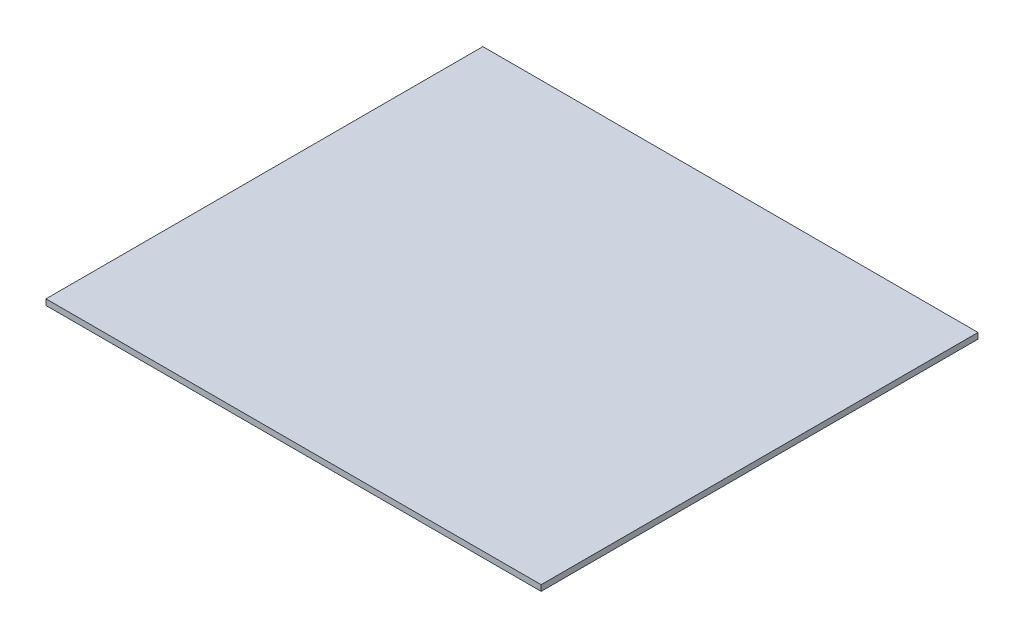
ISO-10303-21;
HEADER;
FILE_DESCRIPTION(('STEP AP214'),'2;1');
FILE_NAME('part.step','',(''),(''),'','','');
FILE_SCHEMA(('AUTOMOTIVE_DESIGN { 1 0 10303 214 1 1 1 1 }'));
ENDSEC;
DATA;
#1=APPLICATION_CONTEXT('core data for automotive mechanical design processes');
#2=APPLICATION_PROTOCOL_DEFINITION('international standard','automotive_design',2000,#1);
#3=PRODUCT_CONTEXT('',#1,'mechanical');
#4=PRODUCT('Part','Part','',(#3));
#5=PRODUCT_RELATED_PRODUCT_CATEGORY('part','',(#4));
#6=PRODUCT_DEFINITION_FORMATION('','',#4);
#7=PRODUCT_DEFINITION_CONTEXT('part definition',#1,'design');
#8=PRODUCT_DEFINITION('design','',#6,#7);
#9=PRODUCT_DEFINITION_SHAPE('','',#8);
#10=(LENGTH_UNIT() NAMED_UNIT(*) SI_UNIT(.MILLI.,.METRE.));
#11=(NAMED_UNIT(*) PLANE_ANGLE_UNIT() SI_UNIT($,.RADIAN.));
#12=(NAMED_UNIT(*) SI_UNIT($,.STERADIAN.) SOLID_ANGLE_UNIT());
#13=UNCERTAINTY_MEASURE_WITH_UNIT(LENGTH_MEASURE(1.E-05),#10,'distance_accuracy_value','');
#14=(GEOMETRIC_REPRESENTATION_CONTEXT(3) GLOBAL_UNCERTAINTY_ASSIGNED_CONTEXT((#13)) GLOBAL_UNIT_ASSIGNED_CONTEXT((#10,
#11,#12)) REPRESENTATION_CONTEXT('',''));
#15=CARTESIAN_POINT('',(0.,0.,0.));
#16=DIRECTION('',(0.,0.,1.));
#17=DIRECTION('',(1.,0.,0.));
#18=AXIS2_PLACEMENT_3D('',#15,#16,#17);
#19=CARTESIAN_POINT('',(0.,14.,0.));
#20=DIRECTION('',(0.,-1.,0.));
#21=DIRECTION('',(0.,0.,-1.));
#22=AXIS2_PLACEMENT_3D('',#19,#20,#21);
#23=PLANE('',#22);
#24=DIRECTION('',(-1.,0.,0.));
#25=VECTOR('',#24,1.);
#26=CARTESIAN_POINT('',(-117.415970164139,14.,146.665591181001));
#27=LINE('',#26,#25);
#28=CARTESIAN_POINT('',(222.584029835861,14.,146.665591181001));
#29=VERTEX_POINT('',#28);
#30=CARTESIAN_POINT('',(-117.415970164139,14.,146.665591181001));
#31=VERTEX_POINT('',#30);
#32=EDGE_CURVE('E76',#29,#31,#27,.T.);
#33=ORIENTED_EDGE('',*,*,#32,.F.);
#34=DIRECTION('',(0.,0.,1.));
#35=VECTOR('',#34,1.);
#36=CARTESIAN_POINT('',(222.584029835861,14.,146.665591181001));
#37=LINE('',#36,#35);
#38=CARTESIAN_POINT('',(222.584029835861,14.,-153.334408818999));
#39=VERTEX_POINT('',#38);
#40=EDGE_CURVE('E83',#39,#29,#37,.T.);
#41=ORIENTED_EDGE('',*,*,#40,.F.);
#42=DIRECTION('',(1.,0.,0.));
#43=VECTOR('',#42,1.);
#44=CARTESIAN_POINT('',(-117.415970164139,14.,-153.334408818999));
#45=LINE('',#44,#43);
#46=CARTESIAN_POINT('',(-117.415970164139,14.,-153.334408818999));
#47=VERTEX_POINT('',#46);
#48=EDGE_CURVE('E106',#47,#39,#45,.T.);
#49=ORIENTED_EDGE('',*,*,#48,.F.);
#50=DIRECTION('',(0.,0.,-1.));
#51=VECTOR('',#50,1.);
#52=CARTESIAN_POINT('',(-117.415970164139,14.,146.665591181001));
#53=LINE('',#52,#51);
#54=EDGE_CURVE('E45',#31,#47,#53,.T.);
#55=ORIENTED_EDGE('',*,*,#54,.F.);
#56=EDGE_LOOP('',(#33,#41,#49,#55));
#57=FACE_BOUND('',#56,.T.);
#58=ADVANCED_FACE('F36',(#57),#23,.F.);
#59=CARTESIAN_POINT('',(0.,10.,0.));
#60=DIRECTION('',(0.,-1.,0.));
#61=DIRECTION('',(0.,0.,-1.));
#62=AXIS2_PLACEMENT_3D('',#59,#60,#61);
#63=PLANE('',#62);
#64=DIRECTION('',(-1.,0.,0.));
#65=VECTOR('',#64,1.);
#66=CARTESIAN_POINT('',(-117.415970164139,10.,146.665591181001));
#67=LINE('',#66,#65);
#68=CARTESIAN_POINT('',(222.584029835861,10.,146.665591181001));
#69=VERTEX_POINT('',#68);
#70=CARTESIAN_POINT('',(-117.415970164139,10.,146.665591181001));
#71=VERTEX_POINT('',#70);
#72=EDGE_CURVE('E94',#69,#71,#67,.T.);
#73=ORIENTED_EDGE('',*,*,#72,.T.);
#74=DIRECTION('',(0.,0.,-1.));
#75=VECTOR('',#74,1.);
#76=CARTESIAN_POINT('',(-117.415970164139,10.,146.665591181001));
#77=LINE('',#76,#75);
#78=CARTESIAN_POINT('',(-117.415970164139,10.,-153.334408818999));
#79=VERTEX_POINT('',#78);
#80=EDGE_CURVE('E12',#71,#79,#77,.T.);
#81=ORIENTED_EDGE('',*,*,#80,.T.);
#82=DIRECTION('',(1.,0.,0.));
#83=VECTOR('',#82,1.);
#84=CARTESIAN_POINT('',(-117.415970164139,10.,-153.334408818999));
#85=LINE('',#84,#83);
#86=CARTESIAN_POINT('',(222.584029835861,10.,-153.334408818999));
#87=VERTEX_POINT('',#86);
#88=EDGE_CURVE('E54',#79,#87,#85,.T.);
#89=ORIENTED_EDGE('',*,*,#88,.T.);
#90=DIRECTION('',(0.,0.,1.));
#91=VECTOR('',#90,1.);
#92=CARTESIAN_POINT('',(222.584029835861,10.,146.665591181001));
#93=LINE('',#92,#91);
#94=EDGE_CURVE('E109',#87,#69,#93,.T.);
#95=ORIENTED_EDGE('',*,*,#94,.T.);
#96=EDGE_LOOP('',(#73,#81,#89,#95));
#97=FACE_BOUND('',#96,.T.);
#98=ADVANCED_FACE('F120',(#97),#63,.T.);
#99=CARTESIAN_POINT('',(-117.415970164139,10.,146.665591181001));
#100=DIRECTION('',(0.,0.,-1.));
#101=DIRECTION('',(-1.,0.,0.));
#102=AXIS2_PLACEMENT_3D('',#99,#100,#101);
#103=PLANE('',#102);
#104=ORIENTED_EDGE('',*,*,#32,.T.);
#105=DIRECTION('',(0.,1.,0.));
#106=VECTOR('',#105,1.);
#107=CARTESIAN_POINT('',(-117.415970164139,10.,146.665591181001));
#108=LINE('',#107,#106);
#109=EDGE_CURVE('E90',#71,#31,#108,.T.);
#110=ORIENTED_EDGE('',*,*,#109,.F.);
#111=ORIENTED_EDGE('',*,*,#72,.F.);
#112=DIRECTION('',(0.,1.,0.));
#113=VECTOR('',#112,1.);
#114=CARTESIAN_POINT('',(222.584029835861,10.,146.665591181001));
#115=LINE('',#114,#113);
#116=EDGE_CURVE('E85',#69,#29,#115,.T.);
#117=ORIENTED_EDGE('',*,*,#116,.T.);
#118=EDGE_LOOP('',(#104,#110,#111,#117));
#119=FACE_BOUND('',#118,.T.);
#120=ADVANCED_FACE('F92',(#119),#103,.F.);
#121=CARTESIAN_POINT('',(222.584029835861,10.,146.665591181001));
#122=DIRECTION('',(-1.,0.,0.));
#123=DIRECTION('',(0.,0.,1.));
#124=AXIS2_PLACEMENT_3D('',#121,#122,#123);
#125=PLANE('',#124);
#126=ORIENTED_EDGE('',*,*,#40,.T.);
#127=ORIENTED_EDGE('',*,*,#116,.F.);
#128=ORIENTED_EDGE('',*,*,#94,.F.);
#129=DIRECTION('',(0.,1.,0.));
#130=VECTOR('',#129,1.);
#131=CARTESIAN_POINT('',(222.584029835861,10.,-153.334408818999));
#132=LINE('',#131,#130);
#133=EDGE_CURVE('E87',#87,#39,#132,.T.);
#134=ORIENTED_EDGE('',*,*,#133,.T.);
#135=EDGE_LOOP('',(#126,#127,#128,#134));
#136=FACE_BOUND('',#135,.T.);
#137=ADVANCED_FACE('F84',(#136),#125,.F.);
#138=CARTESIAN_POINT('',(-117.415970164139,10.,-153.334408818999));
#139=DIRECTION('',(0.,0.,1.));
#140=DIRECTION('',(1.,0.,0.));
#141=AXIS2_PLACEMENT_3D('',#138,#139,#140);
#142=PLANE('',#141);
#143=ORIENTED_EDGE('',*,*,#48,.T.);
#144=ORIENTED_EDGE('',*,*,#133,.F.);
#145=ORIENTED_EDGE('',*,*,#88,.F.);
#146=DIRECTION('',(0.,1.,0.));
#147=VECTOR('',#146,1.);
#148=CARTESIAN_POINT('',(-117.415970164139,10.,-153.334408818999));
#149=LINE('',#148,#147);
#150=EDGE_CURVE('E108',#79,#47,#149,.T.);
#151=ORIENTED_EDGE('',*,*,#150,.T.);
#152=EDGE_LOOP('',(#143,#144,#145,#151));
#153=FACE_BOUND('',#152,.T.);
#154=ADVANCED_FACE('F121',(#153),#142,.F.);
#155=CARTESIAN_POINT('',(-117.415970164139,10.,146.665591181001));
#156=DIRECTION('',(1.,0.,0.));
#157=DIRECTION('',(0.,0.,-1.));
#158=AXIS2_PLACEMENT_3D('',#155,#156,#157);
#159=PLANE('',#158);
#160=ORIENTED_EDGE('',*,*,#54,.T.);
#161=ORIENTED_EDGE('',*,*,#150,.F.);
#162=ORIENTED_EDGE('',*,*,#80,.F.);
#163=ORIENTED_EDGE('',*,*,#109,.T.);
#164=EDGE_LOOP('',(#160,#161,#162,#163));
#165=FACE_BOUND('',#164,.T.);
#166=ADVANCED_FACE('F134',(#165),#159,.F.);
#167=CLOSED_SHELL('',(#58,#98,#120,#137,#154,#166));
#168=MANIFOLD_SOLID_BREP('B2',#167);
#169=ADVANCED_BREP_SHAPE_REPRESENTATION('',(#18,#168),#14);
#170=SHAPE_DEFINITION_REPRESENTATION(#9,#169);
ENDSEC;
END-ISO-10303-21;
